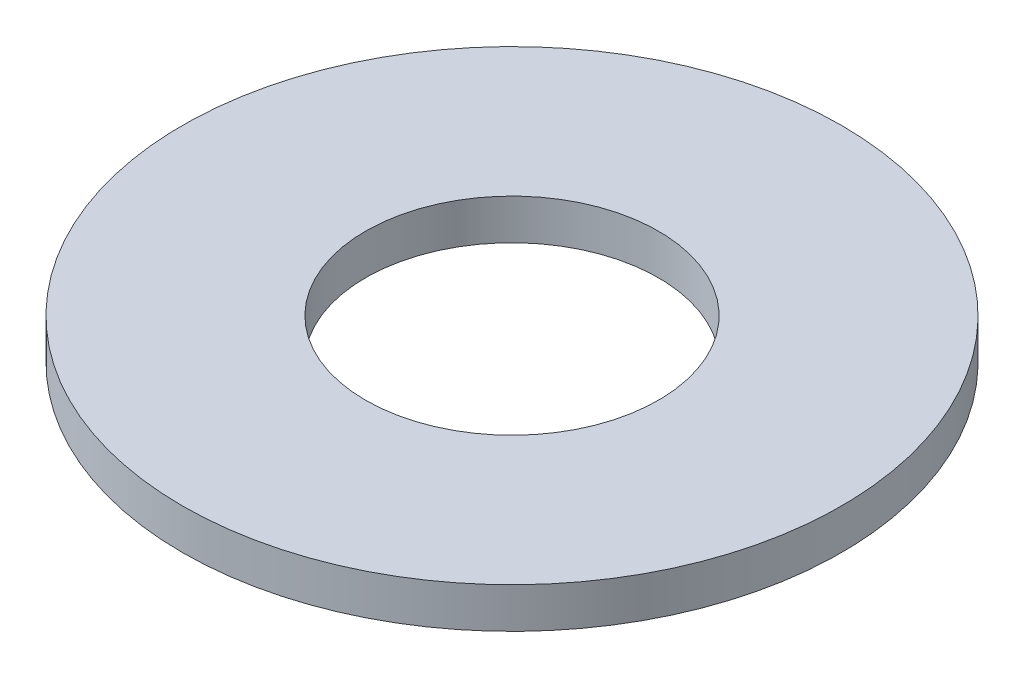
ISO-10303-21;
HEADER;
FILE_DESCRIPTION(('STEP AP214'),'2;1');
FILE_NAME('part.step','',(''),(''),'','','');
FILE_SCHEMA(('AUTOMOTIVE_DESIGN { 1 0 10303 214 1 1 1 1 }'));
ENDSEC;
DATA;
#1=APPLICATION_CONTEXT('core data for automotive mechanical design processes');
#2=APPLICATION_PROTOCOL_DEFINITION('international standard','automotive_design',2000,#1);
#3=PRODUCT_CONTEXT('',#1,'mechanical');
#4=PRODUCT('Part','Part','',(#3));
#5=PRODUCT_RELATED_PRODUCT_CATEGORY('part','',(#4));
#6=PRODUCT_DEFINITION_FORMATION('','',#4);
#7=PRODUCT_DEFINITION_CONTEXT('part definition',#1,'design');
#8=PRODUCT_DEFINITION('design','',#6,#7);
#9=PRODUCT_DEFINITION_SHAPE('','',#8);
#10=(LENGTH_UNIT() NAMED_UNIT(*) SI_UNIT(.MILLI.,.METRE.));
#11=(NAMED_UNIT(*) PLANE_ANGLE_UNIT() SI_UNIT($,.RADIAN.));
#12=(NAMED_UNIT(*) SI_UNIT($,.STERADIAN.) SOLID_ANGLE_UNIT());
#13=UNCERTAINTY_MEASURE_WITH_UNIT(LENGTH_MEASURE(1.E-05),#10,'distance_accuracy_value','');
#14=(GEOMETRIC_REPRESENTATION_CONTEXT(3) GLOBAL_UNCERTAINTY_ASSIGNED_CONTEXT((#13)) GLOBAL_UNIT_ASSIGNED_CONTEXT((#10,
#11,#12)) REPRESENTATION_CONTEXT('',''));
#15=CARTESIAN_POINT('',(0.,0.,0.));
#16=DIRECTION('',(0.,0.,1.));
#17=DIRECTION('',(1.,0.,0.));
#18=AXIS2_PLACEMENT_3D('',#15,#16,#17);
#19=CARTESIAN_POINT('',(0.,1.7526,0.));
#20=DIRECTION('',(0.,-1.,0.));
#21=DIRECTION('',(0.,0.,-1.));
#22=AXIS2_PLACEMENT_3D('',#19,#20,#21);
#23=CYLINDRICAL_SURFACE('',#22,14.2875);
#24=CARTESIAN_POINT('',(0.,1.7526,0.));
#25=DIRECTION('',(0.,1.,0.));
#26=DIRECTION('',(0.,0.,1.));
#27=AXIS2_PLACEMENT_3D('',#24,#25,#26);
#28=CIRCLE('',#27,14.2875);
#29=CARTESIAN_POINT('',(0.,1.7526,14.2875));
#30=VERTEX_POINT('',#29);
#31=EDGE_CURVE('E10',#30,#30,#28,.T.);
#32=ORIENTED_EDGE('',*,*,#31,.F.);
#33=EDGE_LOOP('',(#32));
#34=FACE_BOUND('',#33,.T.);
#35=CARTESIAN_POINT('',(0.,0.,0.));
#36=DIRECTION('',(0.,1.,0.));
#37=DIRECTION('',(0.,0.,1.));
#38=AXIS2_PLACEMENT_3D('',#35,#36,#37);
#39=CIRCLE('',#38,14.2875);
#40=CARTESIAN_POINT('',(0.,0.,14.2875));
#41=VERTEX_POINT('',#40);
#42=EDGE_CURVE('E33',#41,#41,#39,.T.);
#43=ORIENTED_EDGE('',*,*,#42,.T.);
#44=EDGE_LOOP('',(#43));
#45=FACE_BOUND('',#44,.T.);
#46=ADVANCED_FACE('F30',(#34,#45),#23,.T.);
#47=CARTESIAN_POINT('',(0.,1.7526,0.));
#48=DIRECTION('',(0.,1.,0.));
#49=DIRECTION('',(0.,0.,1.));
#50=AXIS2_PLACEMENT_3D('',#47,#48,#49);
#51=PLANE('',#50);
#52=CARTESIAN_POINT('',(0.,1.7526,0.));
#53=DIRECTION('',(0.,1.,0.));
#54=DIRECTION('',(0.,0.,1.));
#55=AXIS2_PLACEMENT_3D('',#52,#53,#54);
#56=CIRCLE('',#55,6.35);
#57=CARTESIAN_POINT('',(0.,1.7526,6.35));
#58=VERTEX_POINT('',#57);
#59=EDGE_CURVE('E42',#58,#58,#56,.T.);
#60=ORIENTED_EDGE('',*,*,#59,.F.);
#61=EDGE_LOOP('',(#60));
#62=FACE_BOUND('',#61,.T.);
#63=ORIENTED_EDGE('',*,*,#31,.T.);
#64=EDGE_LOOP('',(#63));
#65=FACE_BOUND('',#64,.T.);
#66=ADVANCED_FACE('F57',(#62,#65),#51,.T.);
#67=CARTESIAN_POINT('',(0.,0.,0.));
#68=DIRECTION('',(0.,1.,0.));
#69=DIRECTION('',(0.,0.,1.));
#70=AXIS2_PLACEMENT_3D('',#67,#68,#69);
#71=PLANE('',#70);
#72=CARTESIAN_POINT('',(0.,0.,0.));
#73=DIRECTION('',(0.,1.,0.));
#74=DIRECTION('',(0.,0.,1.));
#75=AXIS2_PLACEMENT_3D('',#72,#73,#74);
#76=CIRCLE('',#75,6.35);
#77=CARTESIAN_POINT('',(0.,0.,6.35));
#78=VERTEX_POINT('',#77);
#79=EDGE_CURVE('E40',#78,#78,#76,.T.);
#80=ORIENTED_EDGE('',*,*,#79,.T.);
#81=EDGE_LOOP('',(#80));
#82=FACE_BOUND('',#81,.T.);
#83=ORIENTED_EDGE('',*,*,#42,.F.);
#84=EDGE_LOOP('',(#83));
#85=FACE_BOUND('',#84,.T.);
#86=ADVANCED_FACE('F48',(#82,#85),#71,.F.);
#87=CARTESIAN_POINT('',(0.,0.,0.));
#88=DIRECTION('',(0.,1.,0.));
#89=DIRECTION('',(0.,0.,1.));
#90=AXIS2_PLACEMENT_3D('',#87,#88,#89);
#91=CYLINDRICAL_SURFACE('',#90,6.35);
#92=ORIENTED_EDGE('',*,*,#79,.F.);
#93=EDGE_LOOP('',(#92));
#94=FACE_BOUND('',#93,.T.);
#95=ORIENTED_EDGE('',*,*,#59,.T.);
#96=EDGE_LOOP('',(#95));
#97=FACE_BOUND('',#96,.T.);
#98=ADVANCED_FACE('F51',(#94,#97),#91,.F.);
#99=CLOSED_SHELL('',(#46,#66,#86,#98));
#100=MANIFOLD_SOLID_BREP('B2',#99);
#101=ADVANCED_BREP_SHAPE_REPRESENTATION('',(#18,#100),#14);
#102=SHAPE_DEFINITION_REPRESENTATION(#9,#101);
ENDSEC;
END-ISO-10303-21;
